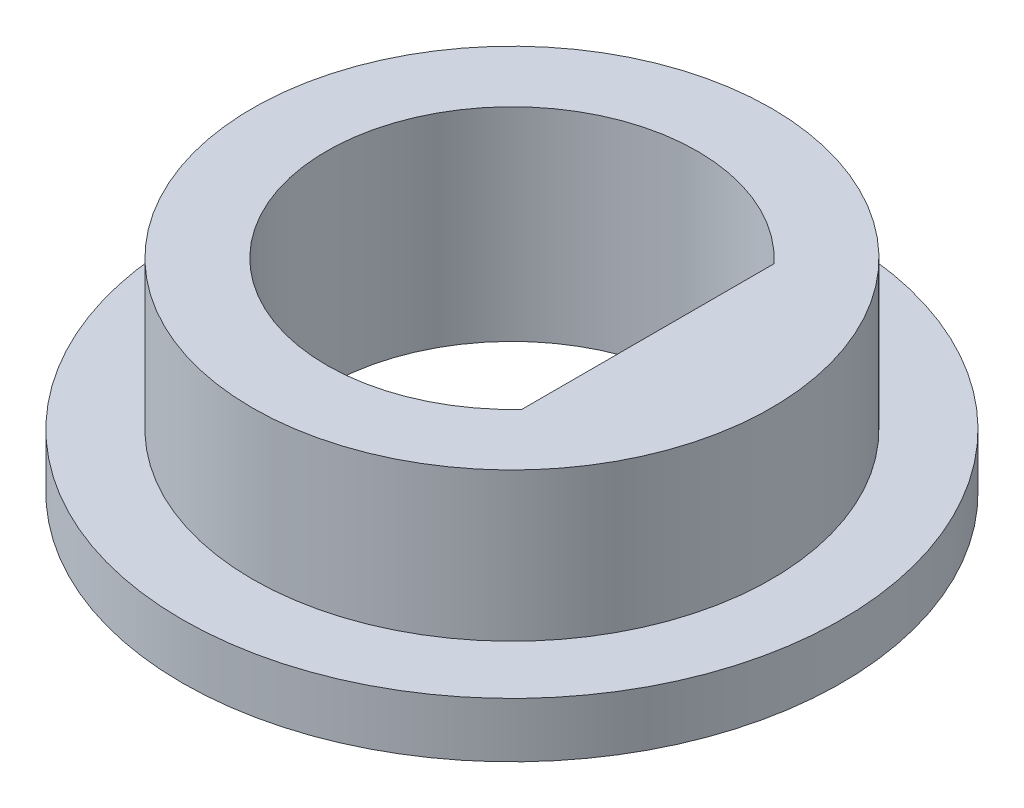
ISO-10303-21;
HEADER;
FILE_DESCRIPTION(('STEP AP214'),'2;1');
FILE_NAME('part.step','',(''),(''),'','','');
FILE_SCHEMA(('AUTOMOTIVE_DESIGN { 1 0 10303 214 1 1 1 1 }'));
ENDSEC;
DATA;
#1=APPLICATION_CONTEXT('core data for automotive mechanical design processes');
#2=APPLICATION_PROTOCOL_DEFINITION('international standard','automotive_design',2000,#1);
#3=PRODUCT_CONTEXT('',#1,'mechanical');
#4=PRODUCT('Part','Part','',(#3));
#5=PRODUCT_RELATED_PRODUCT_CATEGORY('part','',(#4));
#6=PRODUCT_DEFINITION_FORMATION('','',#4);
#7=PRODUCT_DEFINITION_CONTEXT('part definition',#1,'design');
#8=PRODUCT_DEFINITION('design','',#6,#7);
#9=PRODUCT_DEFINITION_SHAPE('','',#8);
#10=(LENGTH_UNIT() NAMED_UNIT(*) SI_UNIT(.MILLI.,.METRE.));
#11=(NAMED_UNIT(*) PLANE_ANGLE_UNIT() SI_UNIT($,.RADIAN.));
#12=(NAMED_UNIT(*) SI_UNIT($,.STERADIAN.) SOLID_ANGLE_UNIT());
#13=UNCERTAINTY_MEASURE_WITH_UNIT(LENGTH_MEASURE(1.E-05),#10,'distance_accuracy_value','');
#14=(GEOMETRIC_REPRESENTATION_CONTEXT(3) GLOBAL_UNCERTAINTY_ASSIGNED_CONTEXT((#13)) GLOBAL_UNIT_ASSIGNED_CONTEXT((#10,
#11,#12)) REPRESENTATION_CONTEXT('',''));
#15=CARTESIAN_POINT('',(0.,0.,0.));
#16=DIRECTION('',(0.,0.,1.));
#17=DIRECTION('',(1.,0.,0.));
#18=AXIS2_PLACEMENT_3D('',#15,#16,#17);
#19=CARTESIAN_POINT('',(0.,1.,0.));
#20=DIRECTION('',(0.,-1.,0.));
#21=DIRECTION('',(0.,0.,-1.));
#22=AXIS2_PLACEMENT_3D('',#19,#20,#21);
#23=CYLINDRICAL_SURFACE('',#22,6.00000000000001);
#24=CARTESIAN_POINT('',(0.,1.,0.));
#25=DIRECTION('',(0.,1.,0.));
#26=DIRECTION('',(0.,0.,1.));
#27=AXIS2_PLACEMENT_3D('',#24,#25,#26);
#28=CIRCLE('',#27,6.00000000000001);
#29=CARTESIAN_POINT('',(0.,1.,6.00000000000001));
#30=VERTEX_POINT('',#29);
#31=EDGE_CURVE('E48',#30,#30,#28,.T.);
#32=ORIENTED_EDGE('',*,*,#31,.F.);
#33=EDGE_LOOP('',(#32));
#34=FACE_BOUND('',#33,.T.);
#35=CARTESIAN_POINT('',(0.,0.,0.));
#36=DIRECTION('',(0.,1.,0.));
#37=DIRECTION('',(0.,0.,1.));
#38=AXIS2_PLACEMENT_3D('',#35,#36,#37);
#39=CIRCLE('',#38,6.00000000000001);
#40=CARTESIAN_POINT('',(0.,0.,6.00000000000001));
#41=VERTEX_POINT('',#40);
#42=EDGE_CURVE('E42',#41,#41,#39,.T.);
#43=ORIENTED_EDGE('',*,*,#42,.T.);
#44=EDGE_LOOP('',(#43));
#45=FACE_BOUND('',#44,.T.);
#46=ADVANCED_FACE('F39',(#34,#45),#23,.T.);
#47=CARTESIAN_POINT('',(0.,1.,0.));
#48=DIRECTION('',(0.,1.,0.));
#49=DIRECTION('',(0.,0.,1.));
#50=AXIS2_PLACEMENT_3D('',#47,#48,#49);
#51=PLANE('',#50);
#52=CARTESIAN_POINT('',(0.,1.,0.));
#53=DIRECTION('',(0.,1.,0.));
#54=DIRECTION('',(0.,0.,1.));
#55=AXIS2_PLACEMENT_3D('',#52,#53,#54);
#56=CIRCLE('',#55,4.725);
#57=CARTESIAN_POINT('',(0.,1.,-4.725));
#58=VERTEX_POINT('',#57);
#59=EDGE_CURVE('E11',#58,#58,#56,.T.);
#60=ORIENTED_EDGE('',*,*,#59,.F.);
#61=EDGE_LOOP('',(#60));
#62=FACE_BOUND('',#61,.T.);
#63=ORIENTED_EDGE('',*,*,#31,.T.);
#64=EDGE_LOOP('',(#63));
#65=FACE_BOUND('',#64,.T.);
#66=ADVANCED_FACE('F106',(#62,#65),#51,.T.);
#67=CARTESIAN_POINT('',(0.,0.,0.));
#68=DIRECTION('',(0.,1.,0.));
#69=DIRECTION('',(0.,0.,1.));
#70=AXIS2_PLACEMENT_3D('',#67,#68,#69);
#71=PLANE('',#70);
#72=DIRECTION('',(0.,0.,-1.));
#73=VECTOR('',#72,1.);
#74=CARTESIAN_POINT('',(2.475,0.,-2.29455878111675));
#75=LINE('',#74,#73);
#76=CARTESIAN_POINT('',(2.475,0.,2.29455878111675));
#77=VERTEX_POINT('',#76);
#78=CARTESIAN_POINT('',(2.475,0.,-2.29455878111675));
#79=VERTEX_POINT('',#78);
#80=EDGE_CURVE('E87',#77,#79,#75,.T.);
#81=ORIENTED_EDGE('',*,*,#80,.T.);
#82=CARTESIAN_POINT('',(0.,0.,0.));
#83=DIRECTION('',(0.,1.,0.));
#84=DIRECTION('',(0.,0.,1.));
#85=AXIS2_PLACEMENT_3D('',#82,#83,#84);
#86=CIRCLE('',#85,3.375);
#87=EDGE_CURVE('E56',#79,#77,#86,.T.);
#88=ORIENTED_EDGE('',*,*,#87,.T.);
#89=EDGE_LOOP('',(#81,#88));
#90=FACE_BOUND('',#89,.T.);
#91=ORIENTED_EDGE('',*,*,#42,.F.);
#92=EDGE_LOOP('',(#91));
#93=FACE_BOUND('',#92,.T.);
#94=ADVANCED_FACE('F103',(#90,#93),#71,.F.);
#95=CARTESIAN_POINT('',(0.,3.7,0.));
#96=DIRECTION('',(0.,-1.,0.));
#97=DIRECTION('',(0.,0.,-1.));
#98=AXIS2_PLACEMENT_3D('',#95,#96,#97);
#99=CYLINDRICAL_SURFACE('',#98,4.725);
#100=CARTESIAN_POINT('',(0.,3.7,0.));
#101=DIRECTION('',(0.,1.,0.));
#102=DIRECTION('',(0.,0.,1.));
#103=AXIS2_PLACEMENT_3D('',#100,#101,#102);
#104=CIRCLE('',#103,4.725);
#105=CARTESIAN_POINT('',(0.,3.7,-4.725));
#106=VERTEX_POINT('',#105);
#107=EDGE_CURVE('E73',#106,#106,#104,.T.);
#108=CARTESIAN_POINT('',(0.,3.7,-4.725));
#109=CARTESIAN_POINT('',(0.,3.671875,-4.725));
#110=CARTESIAN_POINT('',(0.,3.64375,-4.725));
#111=CARTESIAN_POINT('',(0.,3.5875,-4.725));
#112=CARTESIAN_POINT('',(0.,3.559375,-4.725));
#113=CARTESIAN_POINT('',(0.,3.503125,-4.725));
#114=CARTESIAN_POINT('',(0.,3.475,-4.725));
#115=CARTESIAN_POINT('',(0.,3.41875,-4.725));
#116=CARTESIAN_POINT('',(0.,3.390625,-4.725));
#117=CARTESIAN_POINT('',(0.,3.334375,-4.725));
#118=CARTESIAN_POINT('',(0.,3.30625,-4.725));
#119=CARTESIAN_POINT('',(0.,3.25,-4.725));
#120=CARTESIAN_POINT('',(0.,3.221875,-4.725));
#121=CARTESIAN_POINT('',(0.,3.165625,-4.725));
#122=CARTESIAN_POINT('',(0.,3.1375,-4.725));
#123=CARTESIAN_POINT('',(0.,3.08125,-4.725));
#124=CARTESIAN_POINT('',(0.,3.053125,-4.725));
#125=CARTESIAN_POINT('',(0.,2.996875,-4.725));
#126=CARTESIAN_POINT('',(0.,2.96875,-4.725));
#127=CARTESIAN_POINT('',(0.,2.9125,-4.725));
#128=CARTESIAN_POINT('',(0.,2.884375,-4.725));
#129=CARTESIAN_POINT('',(0.,2.828125,-4.725));
#130=CARTESIAN_POINT('',(0.,2.8,-4.725));
#131=CARTESIAN_POINT('',(0.,2.74375,-4.725));
#132=CARTESIAN_POINT('',(0.,2.715625,-4.725));
#133=CARTESIAN_POINT('',(0.,2.659375,-4.725));
#134=CARTESIAN_POINT('',(0.,2.63125,-4.725));
#135=CARTESIAN_POINT('',(0.,2.575,-4.725));
#136=CARTESIAN_POINT('',(0.,2.546875,-4.725));
#137=CARTESIAN_POINT('',(0.,2.490625,-4.725));
#138=CARTESIAN_POINT('',(0.,2.4625,-4.725));
#139=CARTESIAN_POINT('',(0.,2.40625,-4.725));
#140=CARTESIAN_POINT('',(0.,2.378125,-4.725));
#141=CARTESIAN_POINT('',(0.,2.321875,-4.725));
#142=CARTESIAN_POINT('',(0.,2.29375,-4.725));
#143=CARTESIAN_POINT('',(0.,2.2375,-4.725));
#144=CARTESIAN_POINT('',(0.,2.209375,-4.725));
#145=CARTESIAN_POINT('',(0.,2.153125,-4.725));
#146=CARTESIAN_POINT('',(0.,2.125,-4.725));
#147=CARTESIAN_POINT('',(0.,2.06875,-4.725));
#148=CARTESIAN_POINT('',(0.,2.040625,-4.725));
#149=CARTESIAN_POINT('',(0.,1.984375,-4.725));
#150=CARTESIAN_POINT('',(0.,1.95625,-4.725));
#151=CARTESIAN_POINT('',(0.,1.9,-4.725));
#152=CARTESIAN_POINT('',(0.,1.871875,-4.725));
#153=CARTESIAN_POINT('',(0.,1.815625,-4.725));
#154=CARTESIAN_POINT('',(0.,1.7875,-4.725));
#155=CARTESIAN_POINT('',(0.,1.73125,-4.725));
#156=CARTESIAN_POINT('',(0.,1.703125,-4.725));
#157=CARTESIAN_POINT('',(0.,1.646875,-4.725));
#158=CARTESIAN_POINT('',(0.,1.61875,-4.725));
#159=CARTESIAN_POINT('',(0.,1.5625,-4.725));
#160=CARTESIAN_POINT('',(0.,1.534375,-4.725));
#161=CARTESIAN_POINT('',(0.,1.478125,-4.725));
#162=CARTESIAN_POINT('',(0.,1.45,-4.725));
#163=CARTESIAN_POINT('',(0.,1.39375,-4.725));
#164=CARTESIAN_POINT('',(0.,1.365625,-4.725));
#165=CARTESIAN_POINT('',(0.,1.309375,-4.725));
#166=CARTESIAN_POINT('',(0.,1.28125,-4.725));
#167=CARTESIAN_POINT('',(0.,1.225,-4.725));
#168=CARTESIAN_POINT('',(0.,1.196875,-4.725));
#169=CARTESIAN_POINT('',(0.,1.140625,-4.725));
#170=CARTESIAN_POINT('',(0.,1.1125,-4.725));
#171=CARTESIAN_POINT('',(0.,1.05625,-4.725));
#172=CARTESIAN_POINT('',(0.,1.028125,-4.725));
#173=CARTESIAN_POINT('',(0.,1.,-4.725));
#174=B_SPLINE_CURVE_WITH_KNOTS('',3,(#108,#109,#110,#111,#112,#113,#114,#115,#116,#117,#118,
#119,#120,#121,#122,#123,#124,#125,#126,#127,#128,#129,#130,#131,#132,#133,#134,#135,#136,#137,
#138,#139,#140,#141,#142,#143,#144,#145,#146,#147,#148,#149,#150,#151,#152,#153,#154,#155,#156,
#157,#158,#159,#160,#161,#162,#163,#164,#165,#166,#167,#168,#169,#170,#171,#172,#173),
.UNSPECIFIED.,.F.,.F.,(4,2,2,2,2,2,2,2,2,2,2,2,2,2,2,2,2,2,2,2,2,2,2,2,2,2,2,2,2,2,2,2,4),(0.,
0.0843750000000003,0.16875,0.253125,0.3375,0.421875,0.50625,0.590625,0.675,0.759375,0.84375,
0.928125000000001,1.0125,1.096875,1.18125,1.265625,1.35,1.434375,1.51875,1.603125,1.6875,
1.771875,1.85625,1.940625,2.025,2.109375,2.19375,2.278125,2.3625,2.446875,2.53125,2.615625,2.7),.UNSPECIFIED.);
#175=EDGE_CURVE('BSEAM105',#106,#58,#174,.T.);
#176=ORIENTED_EDGE('',*,*,#107,.F.);
#177=ORIENTED_EDGE('',*,*,#59,.T.);
#178=ORIENTED_EDGE('',*,*,#175,.T.);
#179=ORIENTED_EDGE('',*,*,#175,.F.);
#180=EDGE_LOOP('',(#176,#178,#177,#179));
#181=FACE_BOUND('',#180,.T.);
#182=ADVANCED_FACE('F105',(#181),#99,.T.);
#183=CARTESIAN_POINT('',(0.,3.7,0.));
#184=DIRECTION('',(0.,1.,0.));
#185=DIRECTION('',(0.,0.,1.));
#186=AXIS2_PLACEMENT_3D('',#183,#184,#185);
#187=PLANE('',#186);
#188=CARTESIAN_POINT('',(0.,3.7,0.));
#189=DIRECTION('',(0.,1.,0.));
#190=DIRECTION('',(0.,0.,1.));
#191=AXIS2_PLACEMENT_3D('',#188,#189,#190);
#192=CIRCLE('',#191,3.375);
#193=CARTESIAN_POINT('',(2.475,3.7,-2.29455878111675));
#194=VERTEX_POINT('',#193);
#195=CARTESIAN_POINT('',(2.475,3.7,2.29455878111675));
#196=VERTEX_POINT('',#195);
#197=EDGE_CURVE('E61',#194,#196,#192,.T.);
#198=ORIENTED_EDGE('',*,*,#197,.F.);
#199=DIRECTION('',(0.,0.,-1.));
#200=VECTOR('',#199,1.);
#201=CARTESIAN_POINT('',(2.475,3.7,-2.29455878111675));
#202=LINE('',#201,#200);
#203=EDGE_CURVE('E77',#196,#194,#202,.T.);
#204=ORIENTED_EDGE('',*,*,#203,.F.);
#205=EDGE_LOOP('',(#198,#204));
#206=FACE_BOUND('',#205,.T.);
#207=ORIENTED_EDGE('',*,*,#107,.T.);
#208=EDGE_LOOP('',(#207));
#209=FACE_BOUND('',#208,.T.);
#210=ADVANCED_FACE('F82',(#206,#209),#187,.T.);
#211=CARTESIAN_POINT('',(0.,0.,0.));
#212=DIRECTION('',(0.,1.,0.));
#213=DIRECTION('',(0.,0.,1.));
#214=AXIS2_PLACEMENT_3D('',#211,#212,#213);
#215=CYLINDRICAL_SURFACE('',#214,3.375);
#216=ORIENTED_EDGE('',*,*,#197,.T.);
#217=DIRECTION('',(0.,1.,0.));
#218=VECTOR('',#217,1.);
#219=CARTESIAN_POINT('',(2.475,0.,2.29455878111675));
#220=LINE('',#219,#218);
#221=EDGE_CURVE('E74',#77,#196,#220,.T.);
#222=ORIENTED_EDGE('',*,*,#221,.F.);
#223=ORIENTED_EDGE('',*,*,#87,.F.);
#224=DIRECTION('',(0.,1.,0.));
#225=VECTOR('',#224,1.);
#226=CARTESIAN_POINT('',(2.475,0.,-2.29455878111675));
#227=LINE('',#226,#225);
#228=EDGE_CURVE('E66',#79,#194,#227,.T.);
#229=ORIENTED_EDGE('',*,*,#228,.T.);
#230=EDGE_LOOP('',(#216,#222,#223,#229));
#231=FACE_BOUND('',#230,.T.);
#232=ADVANCED_FACE('F68',(#231),#215,.F.);
#233=CARTESIAN_POINT('',(2.475,0.,-2.29455878111675));
#234=DIRECTION('',(1.,0.,0.));
#235=DIRECTION('',(0.,0.,-1.));
#236=AXIS2_PLACEMENT_3D('',#233,#234,#235);
#237=PLANE('',#236);
#238=ORIENTED_EDGE('',*,*,#203,.T.);
#239=ORIENTED_EDGE('',*,*,#228,.F.);
#240=ORIENTED_EDGE('',*,*,#80,.F.);
#241=ORIENTED_EDGE('',*,*,#221,.T.);
#242=EDGE_LOOP('',(#238,#239,#240,#241));
#243=FACE_BOUND('',#242,.T.);
#244=ADVANCED_FACE('F78',(#243),#237,.F.);
#245=CLOSED_SHELL('',(#46,#66,#94,#182,#210,#232,#244));
#246=MANIFOLD_SOLID_BREP('B2',#245);
#247=ADVANCED_BREP_SHAPE_REPRESENTATION('',(#18,#246),#14);
#248=SHAPE_DEFINITION_REPRESENTATION(#9,#247);
ENDSEC;
END-ISO-10303-21;
